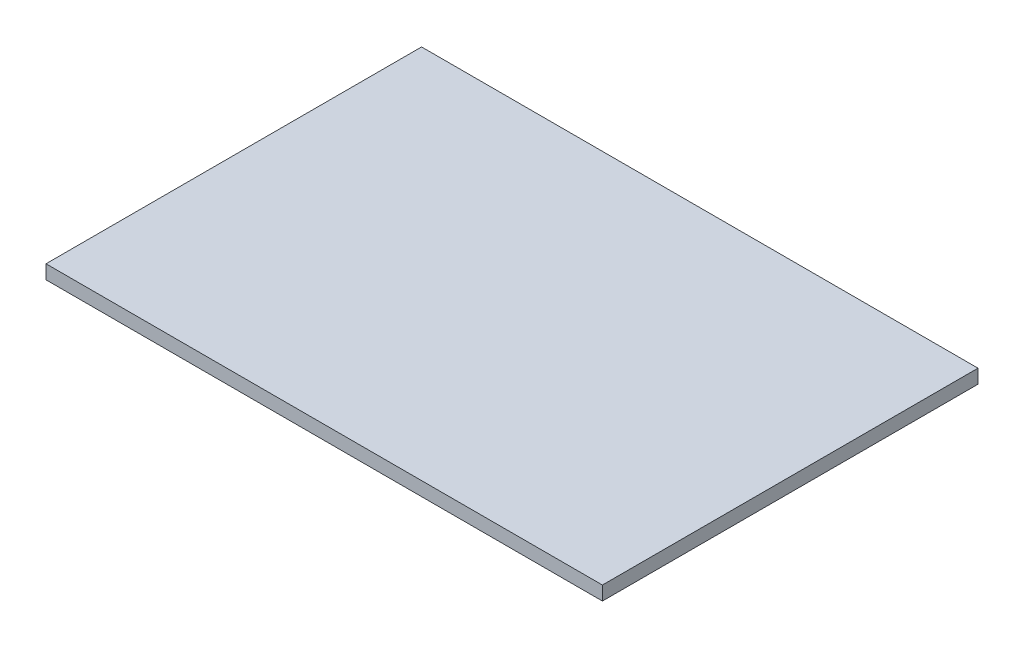
ISO-10303-21;
HEADER;
FILE_DESCRIPTION(('STEP AP214'),'2;1');
FILE_NAME('part.step','',(''),(''),'','','');
FILE_SCHEMA(('AUTOMOTIVE_DESIGN { 1 0 10303 214 1 1 1 1 }'));
ENDSEC;
DATA;
#1=APPLICATION_CONTEXT('core data for automotive mechanical design processes');
#2=APPLICATION_PROTOCOL_DEFINITION('international standard','automotive_design',2000,#1);
#3=PRODUCT_CONTEXT('',#1,'mechanical');
#4=PRODUCT('Part','Part','',(#3));
#5=PRODUCT_RELATED_PRODUCT_CATEGORY('part','',(#4));
#6=PRODUCT_DEFINITION_FORMATION('','',#4);
#7=PRODUCT_DEFINITION_CONTEXT('part definition',#1,'design');
#8=PRODUCT_DEFINITION('design','',#6,#7);
#9=PRODUCT_DEFINITION_SHAPE('','',#8);
#10=(LENGTH_UNIT() NAMED_UNIT(*) SI_UNIT(.MILLI.,.METRE.));
#11=(NAMED_UNIT(*) PLANE_ANGLE_UNIT() SI_UNIT($,.RADIAN.));
#12=(NAMED_UNIT(*) SI_UNIT($,.STERADIAN.) SOLID_ANGLE_UNIT());
#13=UNCERTAINTY_MEASURE_WITH_UNIT(LENGTH_MEASURE(1.E-05),#10,'distance_accuracy_value','');
#14=(GEOMETRIC_REPRESENTATION_CONTEXT(3) GLOBAL_UNCERTAINTY_ASSIGNED_CONTEXT((#13)) GLOBAL_UNIT_ASSIGNED_CONTEXT((#10,
#11,#12)) REPRESENTATION_CONTEXT('',''));
#15=CARTESIAN_POINT('',(0.,0.,0.));
#16=DIRECTION('',(0.,0.,1.));
#17=DIRECTION('',(1.,0.,0.));
#18=AXIS2_PLACEMENT_3D('',#15,#16,#17);
#19=CARTESIAN_POINT('',(0.,1.,0.));
#20=DIRECTION('',(1.,0.,0.));
#21=DIRECTION('',(0.,0.,-1.));
#22=AXIS2_PLACEMENT_3D('',#19,#20,#21);
#23=PLANE('',#22);
#24=DIRECTION('',(0.,0.,1.));
#25=VECTOR('',#24,1.);
#26=CARTESIAN_POINT('',(0.,0.,0.));
#27=LINE('',#26,#25);
#28=CARTESIAN_POINT('',(0.,0.,0.));
#29=VERTEX_POINT('',#28);
#30=CARTESIAN_POINT('',(0.,0.,27.));
#31=VERTEX_POINT('',#30);
#32=EDGE_CURVE('E111',#29,#31,#27,.T.);
#33=ORIENTED_EDGE('',*,*,#32,.T.);
#34=DIRECTION('',(0.,-1.,0.));
#35=VECTOR('',#34,1.);
#36=CARTESIAN_POINT('',(0.,1.,27.));
#37=LINE('',#36,#35);
#38=CARTESIAN_POINT('',(0.,1.,27.));
#39=VERTEX_POINT('',#38);
#40=EDGE_CURVE('E11',#39,#31,#37,.T.);
#41=ORIENTED_EDGE('',*,*,#40,.F.);
#42=DIRECTION('',(0.,0.,1.));
#43=VECTOR('',#42,1.);
#44=CARTESIAN_POINT('',(0.,1.,0.));
#45=LINE('',#44,#43);
#46=CARTESIAN_POINT('',(0.,1.,0.));
#47=VERTEX_POINT('',#46);
#48=EDGE_CURVE('E95',#47,#39,#45,.T.);
#49=ORIENTED_EDGE('',*,*,#48,.F.);
#50=DIRECTION('',(0.,-1.,0.));
#51=VECTOR('',#50,1.);
#52=CARTESIAN_POINT('',(0.,1.,0.));
#53=LINE('',#52,#51);
#54=EDGE_CURVE('E107',#47,#29,#53,.T.);
#55=ORIENTED_EDGE('',*,*,#54,.T.);
#56=EDGE_LOOP('',(#33,#41,#49,#55));
#57=FACE_BOUND('',#56,.T.);
#58=ADVANCED_FACE('F43',(#57),#23,.F.);
#59=CARTESIAN_POINT('',(0.,1.,27.));
#60=DIRECTION('',(0.,0.,-1.));
#61=DIRECTION('',(-1.,0.,0.));
#62=AXIS2_PLACEMENT_3D('',#59,#60,#61);
#63=PLANE('',#62);
#64=DIRECTION('',(1.,0.,0.));
#65=VECTOR('',#64,1.);
#66=CARTESIAN_POINT('',(0.,0.,27.));
#67=LINE('',#66,#65);
#68=CARTESIAN_POINT('',(40.,0.,27.));
#69=VERTEX_POINT('',#68);
#70=EDGE_CURVE('E100',#31,#69,#67,.T.);
#71=ORIENTED_EDGE('',*,*,#70,.T.);
#72=DIRECTION('',(0.,-1.,0.));
#73=VECTOR('',#72,1.);
#74=CARTESIAN_POINT('',(40.,1.,27.));
#75=LINE('',#74,#73);
#76=CARTESIAN_POINT('',(40.,1.,27.));
#77=VERTEX_POINT('',#76);
#78=EDGE_CURVE('E52',#77,#69,#75,.T.);
#79=ORIENTED_EDGE('',*,*,#78,.F.);
#80=DIRECTION('',(1.,0.,0.));
#81=VECTOR('',#80,1.);
#82=CARTESIAN_POINT('',(0.,1.,27.));
#83=LINE('',#82,#81);
#84=EDGE_CURVE('E90',#39,#77,#83,.T.);
#85=ORIENTED_EDGE('',*,*,#84,.F.);
#86=ORIENTED_EDGE('',*,*,#40,.T.);
#87=EDGE_LOOP('',(#71,#79,#85,#86));
#88=FACE_BOUND('',#87,.T.);
#89=ADVANCED_FACE('F99',(#88),#63,.F.);
#90=CARTESIAN_POINT('',(40.,1.,0.));
#91=DIRECTION('',(-1.,0.,0.));
#92=DIRECTION('',(0.,0.,1.));
#93=AXIS2_PLACEMENT_3D('',#90,#91,#92);
#94=PLANE('',#93);
#95=DIRECTION('',(0.,0.,-1.));
#96=VECTOR('',#95,1.);
#97=CARTESIAN_POINT('',(40.,0.,0.));
#98=LINE('',#97,#96);
#99=CARTESIAN_POINT('',(40.,0.,0.));
#100=VERTEX_POINT('',#99);
#101=EDGE_CURVE('E77',#69,#100,#98,.T.);
#102=ORIENTED_EDGE('',*,*,#101,.T.);
#103=DIRECTION('',(0.,-1.,0.));
#104=VECTOR('',#103,1.);
#105=CARTESIAN_POINT('',(40.,1.,0.));
#106=LINE('',#105,#104);
#107=CARTESIAN_POINT('',(40.,1.,0.));
#108=VERTEX_POINT('',#107);
#109=EDGE_CURVE('E102',#108,#100,#106,.T.);
#110=ORIENTED_EDGE('',*,*,#109,.F.);
#111=DIRECTION('',(0.,0.,-1.));
#112=VECTOR('',#111,1.);
#113=CARTESIAN_POINT('',(40.,1.,0.));
#114=LINE('',#113,#112);
#115=EDGE_CURVE('E93',#77,#108,#114,.T.);
#116=ORIENTED_EDGE('',*,*,#115,.F.);
#117=ORIENTED_EDGE('',*,*,#78,.T.);
#118=EDGE_LOOP('',(#102,#110,#116,#117));
#119=FACE_BOUND('',#118,.T.);
#120=ADVANCED_FACE('F103',(#119),#94,.F.);
#121=CARTESIAN_POINT('',(0.,1.,0.));
#122=DIRECTION('',(0.,0.,1.));
#123=DIRECTION('',(1.,0.,0.));
#124=AXIS2_PLACEMENT_3D('',#121,#122,#123);
#125=PLANE('',#124);
#126=DIRECTION('',(-1.,0.,0.));
#127=VECTOR('',#126,1.);
#128=CARTESIAN_POINT('',(0.,0.,0.));
#129=LINE('',#128,#127);
#130=EDGE_CURVE('E83',#100,#29,#129,.T.);
#131=ORIENTED_EDGE('',*,*,#130,.T.);
#132=ORIENTED_EDGE('',*,*,#54,.F.);
#133=DIRECTION('',(-1.,0.,0.));
#134=VECTOR('',#133,1.);
#135=CARTESIAN_POINT('',(0.,1.,0.));
#136=LINE('',#135,#134);
#137=EDGE_CURVE('E60',#108,#47,#136,.T.);
#138=ORIENTED_EDGE('',*,*,#137,.F.);
#139=ORIENTED_EDGE('',*,*,#109,.T.);
#140=EDGE_LOOP('',(#131,#132,#138,#139));
#141=FACE_BOUND('',#140,.T.);
#142=ADVANCED_FACE('F124',(#141),#125,.F.);
#143=CARTESIAN_POINT('',(0.,1.,0.));
#144=DIRECTION('',(0.,1.,0.));
#145=DIRECTION('',(0.,0.,1.));
#146=AXIS2_PLACEMENT_3D('',#143,#144,#145);
#147=PLANE('',#146);
#148=ORIENTED_EDGE('',*,*,#48,.T.);
#149=ORIENTED_EDGE('',*,*,#84,.T.);
#150=ORIENTED_EDGE('',*,*,#115,.T.);
#151=ORIENTED_EDGE('',*,*,#137,.T.);
#152=EDGE_LOOP('',(#148,#149,#150,#151));
#153=FACE_BOUND('',#152,.T.);
#154=ADVANCED_FACE('F91',(#153),#147,.T.);
#155=CARTESIAN_POINT('',(0.,0.,0.));
#156=DIRECTION('',(0.,1.,0.));
#157=DIRECTION('',(0.,0.,1.));
#158=AXIS2_PLACEMENT_3D('',#155,#156,#157);
#159=PLANE('',#158);
#160=ORIENTED_EDGE('',*,*,#32,.F.);
#161=ORIENTED_EDGE('',*,*,#130,.F.);
#162=ORIENTED_EDGE('',*,*,#101,.F.);
#163=ORIENTED_EDGE('',*,*,#70,.F.);
#164=EDGE_LOOP('',(#160,#161,#162,#163));
#165=FACE_BOUND('',#164,.T.);
#166=ADVANCED_FACE('F127',(#165),#159,.F.);
#167=CLOSED_SHELL('',(#58,#89,#120,#142,#154,#166));
#168=MANIFOLD_SOLID_BREP('B2',#167);
#169=ADVANCED_BREP_SHAPE_REPRESENTATION('',(#18,#168),#14);
#170=SHAPE_DEFINITION_REPRESENTATION(#9,#169);
ENDSEC;
END-ISO-10303-21;
